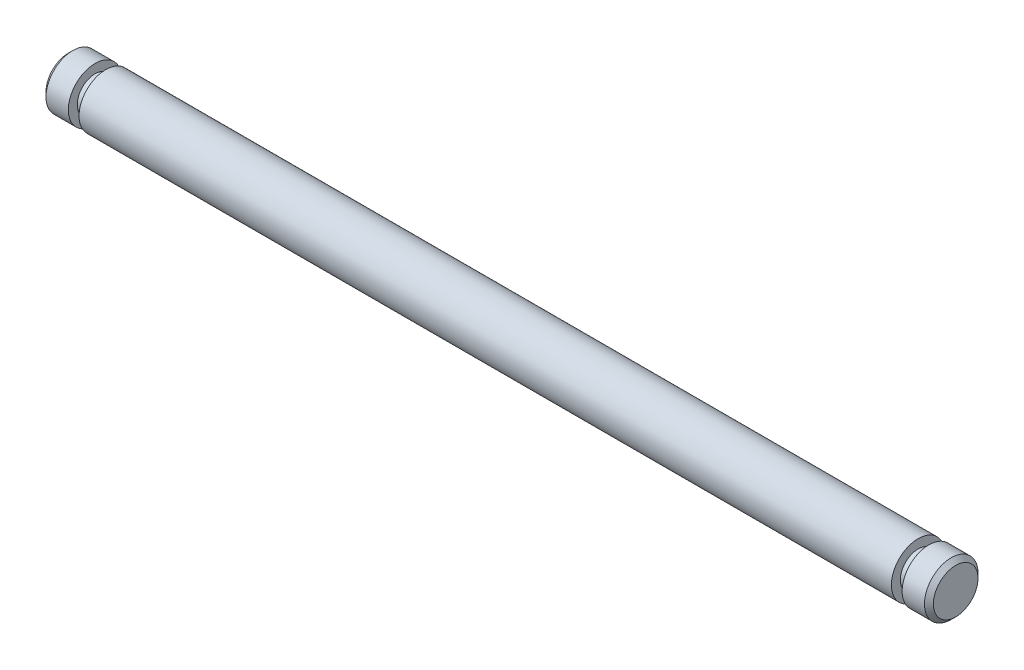
ISO-10303-21;
HEADER;
FILE_DESCRIPTION(('STEP AP214'),'2;1');
FILE_NAME('part.step','',(''),(''),'','','');
FILE_SCHEMA(('AUTOMOTIVE_DESIGN { 1 0 10303 214 1 1 1 1 }'));
ENDSEC;
DATA;
#1=APPLICATION_CONTEXT('core data for automotive mechanical design processes');
#2=APPLICATION_PROTOCOL_DEFINITION('international standard','automotive_design',2000,#1);
#3=PRODUCT_CONTEXT('',#1,'mechanical');
#4=PRODUCT('Part','Part','',(#3));
#5=PRODUCT_RELATED_PRODUCT_CATEGORY('part','',(#4));
#6=PRODUCT_DEFINITION_FORMATION('','',#4);
#7=PRODUCT_DEFINITION_CONTEXT('part definition',#1,'design');
#8=PRODUCT_DEFINITION('design','',#6,#7);
#9=PRODUCT_DEFINITION_SHAPE('','',#8);
#10=(LENGTH_UNIT() NAMED_UNIT(*) SI_UNIT(.MILLI.,.METRE.));
#11=(NAMED_UNIT(*) PLANE_ANGLE_UNIT() SI_UNIT($,.RADIAN.));
#12=(NAMED_UNIT(*) SI_UNIT($,.STERADIAN.) SOLID_ANGLE_UNIT());
#13=UNCERTAINTY_MEASURE_WITH_UNIT(LENGTH_MEASURE(1.E-05),#10,'distance_accuracy_value','');
#14=(GEOMETRIC_REPRESENTATION_CONTEXT(3) GLOBAL_UNCERTAINTY_ASSIGNED_CONTEXT((#13)) GLOBAL_UNIT_ASSIGNED_CONTEXT((#10,
#11,#12)) REPRESENTATION_CONTEXT('',''));
#15=CARTESIAN_POINT('',(0.,0.,0.));
#16=DIRECTION('',(0.,0.,1.));
#17=DIRECTION('',(1.,0.,0.));
#18=AXIS2_PLACEMENT_3D('',#15,#16,#17);
#19=CARTESIAN_POINT('',(-22.75,1.5,0.));
#20=DIRECTION('',(-1.,0.,0.));
#21=DIRECTION('',(0.,0.,1.));
#22=AXIS2_PLACEMENT_3D('',#19,#20,#21);
#23=PLANE('',#22);
#24=CARTESIAN_POINT('',(-22.75,0.,0.));
#25=DIRECTION('',(1.,0.,0.));
#26=DIRECTION('',(0.,0.,-1.));
#27=AXIS2_PLACEMENT_3D('',#24,#25,#26);
#28=CIRCLE('',#27,1.);
#29=CARTESIAN_POINT('',(-22.75,0.,-1.));
#30=VERTEX_POINT('',#29);
#31=EDGE_CURVE('E76',#30,#30,#28,.T.);
#32=ORIENTED_EDGE('',*,*,#31,.T.);
#33=EDGE_LOOP('',(#32));
#34=FACE_BOUND('',#33,.T.);
#35=CARTESIAN_POINT('',(-22.75,0.,0.));
#36=DIRECTION('',(1.,0.,0.));
#37=DIRECTION('',(0.,0.,-1.));
#38=AXIS2_PLACEMENT_3D('',#35,#36,#37);
#39=CIRCLE('',#38,1.5);
#40=CARTESIAN_POINT('',(-22.75,0.,-1.5));
#41=VERTEX_POINT('',#40);
#42=EDGE_CURVE('E55',#41,#41,#39,.T.);
#43=ORIENTED_EDGE('',*,*,#42,.F.);
#44=EDGE_LOOP('',(#43));
#45=FACE_BOUND('',#44,.T.);
#46=ADVANCED_FACE('F34',(#34,#45),#23,.T.);
#47=CARTESIAN_POINT('',(-61.7565258673945,0.,0.));
#48=DIRECTION('',(1.,0.,0.));
#49=DIRECTION('',(0.,0.,-1.));
#50=AXIS2_PLACEMENT_3D('',#47,#48,#49);
#51=CYLINDRICAL_SURFACE('',#50,1.5);
#52=ORIENTED_EDGE('',*,*,#42,.T.);
#53=EDGE_LOOP('',(#52));
#54=FACE_BOUND('',#53,.T.);
#55=CARTESIAN_POINT('',(22.75,0.,0.));
#56=DIRECTION('',(1.,0.,0.));
#57=DIRECTION('',(0.,0.,-1.));
#58=AXIS2_PLACEMENT_3D('',#55,#56,#57);
#59=CIRCLE('',#58,1.5);
#60=CARTESIAN_POINT('',(22.75,0.,-1.5));
#61=VERTEX_POINT('',#60);
#62=EDGE_CURVE('E58',#61,#61,#59,.T.);
#63=ORIENTED_EDGE('',*,*,#62,.F.);
#64=EDGE_LOOP('',(#63));
#65=FACE_BOUND('',#64,.T.);
#66=ADVANCED_FACE('F97',(#54,#65),#51,.T.);
#67=CARTESIAN_POINT('',(22.75,1.5,0.));
#68=DIRECTION('',(1.,0.,0.));
#69=DIRECTION('',(0.,0.,-1.));
#70=AXIS2_PLACEMENT_3D('',#67,#68,#69);
#71=PLANE('',#70);
#72=ORIENTED_EDGE('',*,*,#62,.T.);
#73=EDGE_LOOP('',(#72));
#74=FACE_BOUND('',#73,.T.);
#75=CARTESIAN_POINT('',(22.75,0.,0.));
#76=DIRECTION('',(1.,0.,0.));
#77=DIRECTION('',(0.,0.,-1.));
#78=AXIS2_PLACEMENT_3D('',#75,#76,#77);
#79=CIRCLE('',#78,1.);
#80=CARTESIAN_POINT('',(22.75,0.,-1.));
#81=VERTEX_POINT('',#80);
#82=EDGE_CURVE('E61',#81,#81,#79,.T.);
#83=ORIENTED_EDGE('',*,*,#82,.F.);
#84=EDGE_LOOP('',(#83));
#85=FACE_BOUND('',#84,.T.);
#86=ADVANCED_FACE('F102',(#74,#85),#71,.T.);
#87=CARTESIAN_POINT('',(-61.7565258673945,0.,0.));
#88=DIRECTION('',(1.,0.,0.));
#89=DIRECTION('',(0.,0.,-1.));
#90=AXIS2_PLACEMENT_3D('',#87,#88,#89);
#91=CYLINDRICAL_SURFACE('',#90,1.);
#92=ORIENTED_EDGE('',*,*,#82,.T.);
#93=EDGE_LOOP('',(#92));
#94=FACE_BOUND('',#93,.T.);
#95=CARTESIAN_POINT('',(23.35,0.,0.));
#96=DIRECTION('',(1.,0.,0.));
#97=DIRECTION('',(0.,0.,-1.));
#98=AXIS2_PLACEMENT_3D('',#95,#96,#97);
#99=CIRCLE('',#98,1.);
#100=CARTESIAN_POINT('',(23.35,0.,-1.));
#101=VERTEX_POINT('',#100);
#102=EDGE_CURVE('E64',#101,#101,#99,.T.);
#103=ORIENTED_EDGE('',*,*,#102,.F.);
#104=EDGE_LOOP('',(#103));
#105=FACE_BOUND('',#104,.T.);
#106=ADVANCED_FACE('F113',(#94,#105),#91,.T.);
#107=CARTESIAN_POINT('',(23.35,1.,0.));
#108=DIRECTION('',(-1.,0.,0.));
#109=DIRECTION('',(0.,0.,1.));
#110=AXIS2_PLACEMENT_3D('',#107,#108,#109);
#111=PLANE('',#110);
#112=ORIENTED_EDGE('',*,*,#102,.T.);
#113=EDGE_LOOP('',(#112));
#114=FACE_BOUND('',#113,.T.);
#115=CARTESIAN_POINT('',(23.35,0.,0.));
#116=DIRECTION('',(1.,0.,0.));
#117=DIRECTION('',(0.,0.,-1.));
#118=AXIS2_PLACEMENT_3D('',#115,#116,#117);
#119=CIRCLE('',#118,1.5);
#120=CARTESIAN_POINT('',(23.35,0.,-1.5));
#121=VERTEX_POINT('',#120);
#122=EDGE_CURVE('E67',#121,#121,#119,.T.);
#123=ORIENTED_EDGE('',*,*,#122,.F.);
#124=EDGE_LOOP('',(#123));
#125=FACE_BOUND('',#124,.T.);
#126=ADVANCED_FACE('F117',(#114,#125),#111,.T.);
#127=CARTESIAN_POINT('',(-61.7565258673945,0.,0.));
#128=DIRECTION('',(1.,0.,0.));
#129=DIRECTION('',(0.,0.,-1.));
#130=AXIS2_PLACEMENT_3D('',#127,#128,#129);
#131=CYLINDRICAL_SURFACE('',#130,1.5);
#132=CARTESIAN_POINT('',(24.6,0.,0.));
#133=DIRECTION('',(1.,0.,0.));
#134=DIRECTION('',(0.,0.,-1.));
#135=AXIS2_PLACEMENT_3D('',#132,#133,#134);
#136=CIRCLE('',#135,1.5);
#137=CARTESIAN_POINT('',(24.6,0.,-1.5));
#138=VERTEX_POINT('',#137);
#139=EDGE_CURVE('E10',#138,#138,#136,.F.);
#140=ORIENTED_EDGE('',*,*,#139,.T.);
#141=EDGE_LOOP('',(#140));
#142=FACE_BOUND('',#141,.T.);
#143=ORIENTED_EDGE('',*,*,#122,.T.);
#144=EDGE_LOOP('',(#143));
#145=FACE_BOUND('',#144,.T.);
#146=ADVANCED_FACE('F121',(#142,#145),#131,.T.);
#147=CARTESIAN_POINT('',(24.85,1.5,0.));
#148=DIRECTION('',(1.,0.,0.));
#149=DIRECTION('',(0.,0.,-1.));
#150=AXIS2_PLACEMENT_3D('',#147,#148,#149);
#151=PLANE('',#150);
#152=CARTESIAN_POINT('',(24.85,0.,0.));
#153=DIRECTION('',(1.,0.,0.));
#154=DIRECTION('',(0.,0.,-1.));
#155=AXIS2_PLACEMENT_3D('',#152,#153,#154);
#156=CIRCLE('',#155,1.25);
#157=CARTESIAN_POINT('',(24.85,0.,-1.25));
#158=VERTEX_POINT('',#157);
#159=EDGE_CURVE('E42',#158,#158,#156,.T.);
#160=ORIENTED_EDGE('',*,*,#159,.T.);
#161=EDGE_LOOP('',(#160));
#162=FACE_BOUND('',#161,.T.);
#163=ADVANCED_FACE('F125',(#162),#151,.T.);
#164=CARTESIAN_POINT('',(-24.85,1.5,0.));
#165=DIRECTION('',(-1.,0.,0.));
#166=DIRECTION('',(0.,0.,1.));
#167=AXIS2_PLACEMENT_3D('',#164,#165,#166);
#168=PLANE('',#167);
#169=CARTESIAN_POINT('',(-24.85,0.,0.));
#170=DIRECTION('',(-1.,0.,0.));
#171=DIRECTION('',(0.,0.,1.));
#172=AXIS2_PLACEMENT_3D('',#169,#170,#171);
#173=CIRCLE('',#172,1.25000000000001);
#174=CARTESIAN_POINT('',(-24.85,0.,1.25000000000001));
#175=VERTEX_POINT('',#174);
#176=EDGE_CURVE('E46',#175,#175,#173,.T.);
#177=ORIENTED_EDGE('',*,*,#176,.T.);
#178=EDGE_LOOP('',(#177));
#179=FACE_BOUND('',#178,.T.);
#180=ADVANCED_FACE('F128',(#179),#168,.T.);
#181=CARTESIAN_POINT('',(-61.7565258673945,0.,0.));
#182=DIRECTION('',(1.,0.,0.));
#183=DIRECTION('',(0.,0.,-1.));
#184=AXIS2_PLACEMENT_3D('',#181,#182,#183);
#185=CYLINDRICAL_SURFACE('',#184,1.5);
#186=CARTESIAN_POINT('',(-24.6,0.,0.));
#187=DIRECTION('',(-1.,0.,0.));
#188=DIRECTION('',(0.,0.,1.));
#189=AXIS2_PLACEMENT_3D('',#186,#187,#188);
#190=CIRCLE('',#189,1.5);
#191=CARTESIAN_POINT('',(-24.6,0.,1.5));
#192=VERTEX_POINT('',#191);
#193=EDGE_CURVE('E50',#192,#192,#190,.F.);
#194=ORIENTED_EDGE('',*,*,#193,.T.);
#195=EDGE_LOOP('',(#194));
#196=FACE_BOUND('',#195,.T.);
#197=CARTESIAN_POINT('',(-23.35,0.,0.));
#198=DIRECTION('',(1.,0.,0.));
#199=DIRECTION('',(0.,0.,-1.));
#200=AXIS2_PLACEMENT_3D('',#197,#198,#199);
#201=CIRCLE('',#200,1.5);
#202=CARTESIAN_POINT('',(-23.35,0.,-1.5));
#203=VERTEX_POINT('',#202);
#204=EDGE_CURVE('E70',#203,#203,#201,.T.);
#205=ORIENTED_EDGE('',*,*,#204,.F.);
#206=EDGE_LOOP('',(#205));
#207=FACE_BOUND('',#206,.T.);
#208=ADVANCED_FACE('F93',(#196,#207),#185,.T.);
#209=CARTESIAN_POINT('',(-23.35,1.,0.));
#210=DIRECTION('',(1.,0.,0.));
#211=DIRECTION('',(0.,0.,-1.));
#212=AXIS2_PLACEMENT_3D('',#209,#210,#211);
#213=PLANE('',#212);
#214=ORIENTED_EDGE('',*,*,#204,.T.);
#215=EDGE_LOOP('',(#214));
#216=FACE_BOUND('',#215,.T.);
#217=CARTESIAN_POINT('',(-23.35,0.,0.));
#218=DIRECTION('',(1.,0.,0.));
#219=DIRECTION('',(0.,0.,-1.));
#220=AXIS2_PLACEMENT_3D('',#217,#218,#219);
#221=CIRCLE('',#220,1.);
#222=CARTESIAN_POINT('',(-23.35,0.,-1.));
#223=VERTEX_POINT('',#222);
#224=EDGE_CURVE('E73',#223,#223,#221,.T.);
#225=ORIENTED_EDGE('',*,*,#224,.F.);
#226=EDGE_LOOP('',(#225));
#227=FACE_BOUND('',#226,.T.);
#228=ADVANCED_FACE('F85',(#216,#227),#213,.T.);
#229=CARTESIAN_POINT('',(-61.7565258673945,0.,0.));
#230=DIRECTION('',(1.,0.,0.));
#231=DIRECTION('',(0.,0.,-1.));
#232=AXIS2_PLACEMENT_3D('',#229,#230,#231);
#233=CYLINDRICAL_SURFACE('',#232,1.);
#234=ORIENTED_EDGE('',*,*,#224,.T.);
#235=EDGE_LOOP('',(#234));
#236=FACE_BOUND('',#235,.T.);
#237=ORIENTED_EDGE('',*,*,#31,.F.);
#238=EDGE_LOOP('',(#237));
#239=FACE_BOUND('',#238,.T.);
#240=ADVANCED_FACE('F82',(#236,#239),#233,.T.);
#241=CARTESIAN_POINT('',(-24.6,0.,0.));
#242=DIRECTION('',(1.,0.,0.));
#243=DIRECTION('',(0.,0.,-1.));
#244=AXIS2_PLACEMENT_3D('',#241,#242,#243);
#245=CONICAL_SURFACE('',#244,1.5,0.785398163397455);
#246=ORIENTED_EDGE('',*,*,#176,.F.);
#247=EDGE_LOOP('',(#246));
#248=FACE_BOUND('',#247,.T.);
#249=ORIENTED_EDGE('',*,*,#193,.F.);
#250=EDGE_LOOP('',(#249));
#251=FACE_BOUND('',#250,.T.);
#252=ADVANCED_FACE('F84',(#248,#251),#245,.T.);
#253=CARTESIAN_POINT('',(24.85,0.,0.));
#254=DIRECTION('',(-1.,0.,0.));
#255=DIRECTION('',(0.,0.,1.));
#256=AXIS2_PLACEMENT_3D('',#253,#254,#255);
#257=CONICAL_SURFACE('',#256,1.25,0.785398163397455);
#258=ORIENTED_EDGE('',*,*,#139,.F.);
#259=EDGE_LOOP('',(#258));
#260=FACE_BOUND('',#259,.T.);
#261=ORIENTED_EDGE('',*,*,#159,.F.);
#262=EDGE_LOOP('',(#261));
#263=FACE_BOUND('',#262,.T.);
#264=ADVANCED_FACE('F37',(#260,#263),#257,.T.);
#265=CLOSED_SHELL('',(#46,#66,#86,#106,#126,#146,#163,#180,#208,#228,#240,#252,#264));
#266=MANIFOLD_SOLID_BREP('B2',#265);
#267=ADVANCED_BREP_SHAPE_REPRESENTATION('',(#18,#266),#14);
#268=SHAPE_DEFINITION_REPRESENTATION(#9,#267);
ENDSEC;
END-ISO-10303-21;
